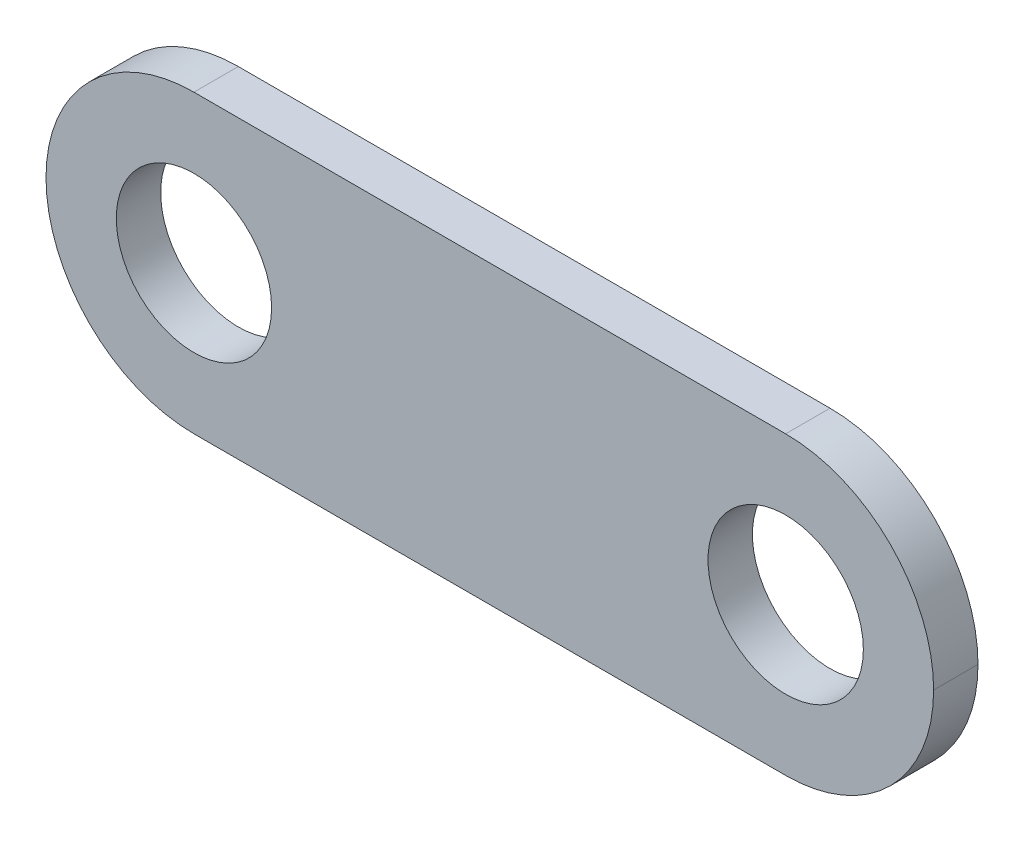
ISO-10303-21;
HEADER;
FILE_DESCRIPTION(('STEP AP214'),'2;1');
FILE_NAME('part.step','',(''),(''),'','','');
FILE_SCHEMA(('AUTOMOTIVE_DESIGN { 1 0 10303 214 1 1 1 1 }'));
ENDSEC;
DATA;
#1=APPLICATION_CONTEXT('core data for automotive mechanical design processes');
#2=APPLICATION_PROTOCOL_DEFINITION('international standard','automotive_design',2000,#1);
#3=PRODUCT_CONTEXT('',#1,'mechanical');
#4=PRODUCT('Part','Part','',(#3));
#5=PRODUCT_RELATED_PRODUCT_CATEGORY('part','',(#4));
#6=PRODUCT_DEFINITION_FORMATION('','',#4);
#7=PRODUCT_DEFINITION_CONTEXT('part definition',#1,'design');
#8=PRODUCT_DEFINITION('design','',#6,#7);
#9=PRODUCT_DEFINITION_SHAPE('','',#8);
#10=(LENGTH_UNIT() NAMED_UNIT(*) SI_UNIT(.MILLI.,.METRE.));
#11=(NAMED_UNIT(*) PLANE_ANGLE_UNIT() SI_UNIT($,.RADIAN.));
#12=(NAMED_UNIT(*) SI_UNIT($,.STERADIAN.) SOLID_ANGLE_UNIT());
#13=UNCERTAINTY_MEASURE_WITH_UNIT(LENGTH_MEASURE(1.E-05),#10,'distance_accuracy_value','');
#14=(GEOMETRIC_REPRESENTATION_CONTEXT(3) GLOBAL_UNCERTAINTY_ASSIGNED_CONTEXT((#13)) GLOBAL_UNIT_ASSIGNED_CONTEXT((#10,
#11,#12)) REPRESENTATION_CONTEXT('',''));
#15=CARTESIAN_POINT('',(0.,0.,0.));
#16=DIRECTION('',(0.,0.,1.));
#17=DIRECTION('',(1.,0.,0.));
#18=AXIS2_PLACEMENT_3D('',#15,#16,#17);
#19=CARTESIAN_POINT('',(0.,0.,0.));
#20=DIRECTION('',(0.,0.,-1.));
#21=DIRECTION('',(-1.,0.,0.));
#22=AXIS2_PLACEMENT_3D('',#19,#20,#21);
#23=PLANE('',#22);
#24=CARTESIAN_POINT('',(50.,10.,0.));
#25=DIRECTION('',(0.,0.,-1.));
#26=DIRECTION('',(-1.,0.,0.));
#27=AXIS2_PLACEMENT_3D('',#24,#25,#26);
#28=CIRCLE('',#27,10.);
#29=CARTESIAN_POINT('',(50.,20.,0.));
#30=VERTEX_POINT('',#29);
#31=CARTESIAN_POINT('',(60.,10.,0.));
#32=VERTEX_POINT('',#31);
#33=EDGE_CURVE('E99',#30,#32,#28,.T.);
#34=ORIENTED_EDGE('',*,*,#33,.T.);
#35=CARTESIAN_POINT('',(50.,10.,0.));
#36=DIRECTION('',(0.,0.,-1.));
#37=DIRECTION('',(-1.,0.,0.));
#38=AXIS2_PLACEMENT_3D('',#35,#36,#37);
#39=CIRCLE('',#38,10.);
#40=CARTESIAN_POINT('',(50.,0.,0.));
#41=VERTEX_POINT('',#40);
#42=EDGE_CURVE('E129',#32,#41,#39,.T.);
#43=ORIENTED_EDGE('',*,*,#42,.T.);
#44=DIRECTION('',(1.,0.,0.));
#45=VECTOR('',#44,1.);
#46=CARTESIAN_POINT('',(0.,0.,0.));
#47=LINE('',#46,#45);
#48=CARTESIAN_POINT('',(10.,0.,0.));
#49=VERTEX_POINT('',#48);
#50=EDGE_CURVE('E94',#49,#41,#47,.T.);
#51=ORIENTED_EDGE('',*,*,#50,.F.);
#52=CARTESIAN_POINT('',(10.,10.,0.));
#53=DIRECTION('',(0.,0.,-1.));
#54=DIRECTION('',(-1.,0.,0.));
#55=AXIS2_PLACEMENT_3D('',#52,#53,#54);
#56=CIRCLE('',#55,10.);
#57=CARTESIAN_POINT('',(0.,10.,0.));
#58=VERTEX_POINT('',#57);
#59=EDGE_CURVE('E88',#49,#58,#56,.T.);
#60=ORIENTED_EDGE('',*,*,#59,.T.);
#61=CARTESIAN_POINT('',(10.,10.,0.));
#62=DIRECTION('',(0.,0.,-1.));
#63=DIRECTION('',(-1.,0.,0.));
#64=AXIS2_PLACEMENT_3D('',#61,#62,#63);
#65=CIRCLE('',#64,10.);
#66=CARTESIAN_POINT('',(10.,20.,0.));
#67=VERTEX_POINT('',#66);
#68=EDGE_CURVE('E92',#58,#67,#65,.T.);
#69=ORIENTED_EDGE('',*,*,#68,.T.);
#70=DIRECTION('',(-1.,0.,0.));
#71=VECTOR('',#70,1.);
#72=CARTESIAN_POINT('',(0.,20.,0.));
#73=LINE('',#72,#71);
#74=EDGE_CURVE('E124',#30,#67,#73,.T.);
#75=ORIENTED_EDGE('',*,*,#74,.F.);
#76=EDGE_LOOP('',(#34,#43,#51,#60,#69,#75));
#77=FACE_BOUND('',#76,.T.);
#78=CARTESIAN_POINT('',(50.,10.,0.));
#79=DIRECTION('',(0.,0.,1.));
#80=DIRECTION('',(1.,0.,0.));
#81=AXIS2_PLACEMENT_3D('',#78,#79,#80);
#82=CIRCLE('',#81,5.25);
#83=CARTESIAN_POINT('',(55.25,10.,0.));
#84=VERTEX_POINT('',#83);
#85=EDGE_CURVE('E110',#84,#84,#82,.T.);
#86=ORIENTED_EDGE('',*,*,#85,.T.);
#87=EDGE_LOOP('',(#86));
#88=FACE_BOUND('',#87,.T.);
#89=CARTESIAN_POINT('',(9.99999999999999,10.,0.));
#90=DIRECTION('',(0.,0.,1.));
#91=DIRECTION('',(1.,0.,0.));
#92=AXIS2_PLACEMENT_3D('',#89,#90,#91);
#93=CIRCLE('',#92,5.25);
#94=CARTESIAN_POINT('',(15.25,10.,0.));
#95=VERTEX_POINT('',#94);
#96=EDGE_CURVE('E117',#95,#95,#93,.T.);
#97=ORIENTED_EDGE('',*,*,#96,.T.);
#98=EDGE_LOOP('',(#97));
#99=FACE_BOUND('',#98,.T.);
#100=ADVANCED_FACE('F35',(#77,#88,#99),#23,.T.);
#101=CARTESIAN_POINT('',(0.,0.,3.));
#102=DIRECTION('',(0.,1.,0.));
#103=DIRECTION('',(0.,0.,1.));
#104=AXIS2_PLACEMENT_3D('',#101,#102,#103);
#105=PLANE('',#104);
#106=ORIENTED_EDGE('',*,*,#50,.T.);
#107=DIRECTION('',(0.,0.,-1.));
#108=VECTOR('',#107,1.);
#109=CARTESIAN_POINT('',(50.,0.,3.));
#110=LINE('',#109,#108);
#111=CARTESIAN_POINT('',(50.,0.,3.));
#112=VERTEX_POINT('',#111);
#113=EDGE_CURVE('E133',#41,#112,#110,.F.);
#114=ORIENTED_EDGE('',*,*,#113,.T.);
#115=DIRECTION('',(1.,0.,0.));
#116=VECTOR('',#115,1.);
#117=CARTESIAN_POINT('',(0.,0.,3.));
#118=LINE('',#117,#116);
#119=CARTESIAN_POINT('',(10.,0.,3.));
#120=VERTEX_POINT('',#119);
#121=EDGE_CURVE('E121',#120,#112,#118,.T.);
#122=ORIENTED_EDGE('',*,*,#121,.F.);
#123=DIRECTION('',(0.,0.,-1.));
#124=VECTOR('',#123,1.);
#125=CARTESIAN_POINT('',(10.,0.,3.));
#126=LINE('',#125,#124);
#127=EDGE_CURVE('E131',#120,#49,#126,.T.);
#128=ORIENTED_EDGE('',*,*,#127,.T.);
#129=EDGE_LOOP('',(#106,#114,#122,#128));
#130=FACE_BOUND('',#129,.T.);
#131=ADVANCED_FACE('F154',(#130),#105,.F.);
#132=CARTESIAN_POINT('',(0.,20.,3.));
#133=DIRECTION('',(0.,-1.,0.));
#134=DIRECTION('',(0.,0.,-1.));
#135=AXIS2_PLACEMENT_3D('',#132,#133,#134);
#136=PLANE('',#135);
#137=DIRECTION('',(-1.,0.,0.));
#138=VECTOR('',#137,1.);
#139=CARTESIAN_POINT('',(0.,20.,3.));
#140=LINE('',#139,#138);
#141=CARTESIAN_POINT('',(50.,20.,3.));
#142=VERTEX_POINT('',#141);
#143=CARTESIAN_POINT('',(10.,20.,3.));
#144=VERTEX_POINT('',#143);
#145=EDGE_CURVE('E105',#142,#144,#140,.T.);
#146=ORIENTED_EDGE('',*,*,#145,.F.);
#147=DIRECTION('',(0.,0.,-1.));
#148=VECTOR('',#147,1.);
#149=CARTESIAN_POINT('',(50.,20.,3.));
#150=LINE('',#149,#148);
#151=EDGE_CURVE('E11',#142,#30,#150,.T.);
#152=ORIENTED_EDGE('',*,*,#151,.T.);
#153=ORIENTED_EDGE('',*,*,#74,.T.);
#154=DIRECTION('',(0.,0.,-1.));
#155=VECTOR('',#154,1.);
#156=CARTESIAN_POINT('',(10.,20.,3.));
#157=LINE('',#156,#155);
#158=EDGE_CURVE('E44',#67,#144,#157,.F.);
#159=ORIENTED_EDGE('',*,*,#158,.T.);
#160=EDGE_LOOP('',(#146,#152,#153,#159));
#161=FACE_BOUND('',#160,.T.);
#162=ADVANCED_FACE('F156',(#161),#136,.F.);
#163=CARTESIAN_POINT('',(0.,0.,3.));
#164=DIRECTION('',(0.,0.,-1.));
#165=DIRECTION('',(-1.,0.,0.));
#166=AXIS2_PLACEMENT_3D('',#163,#164,#165);
#167=PLANE('',#166);
#168=CARTESIAN_POINT('',(9.99999999999999,10.,3.));
#169=DIRECTION('',(0.,0.,1.));
#170=DIRECTION('',(1.,0.,0.));
#171=AXIS2_PLACEMENT_3D('',#168,#169,#170);
#172=CIRCLE('',#171,5.25);
#173=CARTESIAN_POINT('',(15.25,10.,3.));
#174=VERTEX_POINT('',#173);
#175=EDGE_CURVE('E247',#174,#174,#172,.T.);
#176=ORIENTED_EDGE('',*,*,#175,.F.);
#177=EDGE_LOOP('',(#176));
#178=FACE_BOUND('',#177,.T.);
#179=CARTESIAN_POINT('',(50.,10.,3.));
#180=DIRECTION('',(0.,0.,1.));
#181=DIRECTION('',(1.,0.,0.));
#182=AXIS2_PLACEMENT_3D('',#179,#180,#181);
#183=CIRCLE('',#182,5.25);
#184=CARTESIAN_POINT('',(55.25,10.,3.));
#185=VERTEX_POINT('',#184);
#186=EDGE_CURVE('E113',#185,#185,#183,.T.);
#187=ORIENTED_EDGE('',*,*,#186,.F.);
#188=EDGE_LOOP('',(#187));
#189=FACE_BOUND('',#188,.T.);
#190=ORIENTED_EDGE('',*,*,#121,.T.);
#191=CARTESIAN_POINT('',(50.,10.,3.));
#192=DIRECTION('',(0.,0.,-1.));
#193=DIRECTION('',(-1.,0.,0.));
#194=AXIS2_PLACEMENT_3D('',#191,#192,#193);
#195=CIRCLE('',#194,10.);
#196=CARTESIAN_POINT('',(60.,10.,3.));
#197=VERTEX_POINT('',#196);
#198=EDGE_CURVE('E140',#112,#197,#195,.F.);
#199=ORIENTED_EDGE('',*,*,#198,.T.);
#200=CARTESIAN_POINT('',(50.,10.,3.));
#201=DIRECTION('',(0.,0.,-1.));
#202=DIRECTION('',(-1.,0.,0.));
#203=AXIS2_PLACEMENT_3D('',#200,#201,#202);
#204=CIRCLE('',#203,10.);
#205=EDGE_CURVE('E58',#197,#142,#204,.F.);
#206=ORIENTED_EDGE('',*,*,#205,.T.);
#207=ORIENTED_EDGE('',*,*,#145,.T.);
#208=CARTESIAN_POINT('',(10.,10.,3.));
#209=DIRECTION('',(0.,0.,-1.));
#210=DIRECTION('',(-1.,0.,0.));
#211=AXIS2_PLACEMENT_3D('',#208,#209,#210);
#212=CIRCLE('',#211,10.);
#213=CARTESIAN_POINT('',(0.,10.,3.));
#214=VERTEX_POINT('',#213);
#215=EDGE_CURVE('E136',#144,#214,#212,.F.);
#216=ORIENTED_EDGE('',*,*,#215,.T.);
#217=CARTESIAN_POINT('',(10.,10.,3.));
#218=DIRECTION('',(0.,0.,-1.));
#219=DIRECTION('',(-1.,0.,0.));
#220=AXIS2_PLACEMENT_3D('',#217,#218,#219);
#221=CIRCLE('',#220,10.);
#222=EDGE_CURVE('E108',#214,#120,#221,.F.);
#223=ORIENTED_EDGE('',*,*,#222,.T.);
#224=EDGE_LOOP('',(#190,#199,#206,#207,#216,#223));
#225=FACE_BOUND('',#224,.T.);
#226=ADVANCED_FACE('F142',(#178,#189,#225),#167,.F.);
#227=CARTESIAN_POINT('',(50.,10.,3.));
#228=DIRECTION('',(0.,0.,-1.));
#229=DIRECTION('',(-1.,0.,0.));
#230=AXIS2_PLACEMENT_3D('',#227,#228,#229);
#231=CYLINDRICAL_SURFACE('',#230,10.);
#232=ORIENTED_EDGE('',*,*,#151,.F.);
#233=ORIENTED_EDGE('',*,*,#205,.F.);
#234=DIRECTION('',(0.,0.,-1.));
#235=VECTOR('',#234,1.);
#236=CARTESIAN_POINT('',(60.,10.,3.));
#237=LINE('',#236,#235);
#238=EDGE_CURVE('E109',#32,#197,#237,.F.);
#239=ORIENTED_EDGE('',*,*,#238,.F.);
#240=ORIENTED_EDGE('',*,*,#33,.F.);
#241=EDGE_LOOP('',(#232,#233,#239,#240));
#242=FACE_BOUND('',#241,.T.);
#243=ADVANCED_FACE('F149',(#242),#231,.T.);
#244=CARTESIAN_POINT('',(50.,10.,3.));
#245=DIRECTION('',(0.,0.,-1.));
#246=DIRECTION('',(-1.,0.,0.));
#247=AXIS2_PLACEMENT_3D('',#244,#245,#246);
#248=CYLINDRICAL_SURFACE('',#247,10.);
#249=ORIENTED_EDGE('',*,*,#198,.F.);
#250=ORIENTED_EDGE('',*,*,#113,.F.);
#251=ORIENTED_EDGE('',*,*,#42,.F.);
#252=ORIENTED_EDGE('',*,*,#238,.T.);
#253=EDGE_LOOP('',(#249,#250,#251,#252));
#254=FACE_BOUND('',#253,.T.);
#255=ADVANCED_FACE('F152',(#254),#248,.T.);
#256=CARTESIAN_POINT('',(10.,10.,3.));
#257=DIRECTION('',(0.,0.,-1.));
#258=DIRECTION('',(-1.,0.,0.));
#259=AXIS2_PLACEMENT_3D('',#256,#257,#258);
#260=CYLINDRICAL_SURFACE('',#259,10.);
#261=DIRECTION('',(0.,0.,-1.));
#262=VECTOR('',#261,1.);
#263=CARTESIAN_POINT('',(0.,10.,3.));
#264=LINE('',#263,#262);
#265=EDGE_CURVE('E39',#214,#58,#264,.T.);
#266=ORIENTED_EDGE('',*,*,#265,.F.);
#267=ORIENTED_EDGE('',*,*,#215,.F.);
#268=ORIENTED_EDGE('',*,*,#158,.F.);
#269=ORIENTED_EDGE('',*,*,#68,.F.);
#270=EDGE_LOOP('',(#266,#267,#268,#269));
#271=FACE_BOUND('',#270,.T.);
#272=ADVANCED_FACE('F37',(#271),#260,.T.);
#273=CARTESIAN_POINT('',(10.,10.,3.));
#274=DIRECTION('',(0.,0.,-1.));
#275=DIRECTION('',(-1.,0.,0.));
#276=AXIS2_PLACEMENT_3D('',#273,#274,#275);
#277=CYLINDRICAL_SURFACE('',#276,10.);
#278=ORIENTED_EDGE('',*,*,#222,.F.);
#279=ORIENTED_EDGE('',*,*,#265,.T.);
#280=ORIENTED_EDGE('',*,*,#59,.F.);
#281=ORIENTED_EDGE('',*,*,#127,.F.);
#282=EDGE_LOOP('',(#278,#279,#280,#281));
#283=FACE_BOUND('',#282,.T.);
#284=ADVANCED_FACE('F107',(#283),#277,.T.);
#285=CARTESIAN_POINT('',(50.,10.,3.));
#286=DIRECTION('',(0.,0.,1.));
#287=DIRECTION('',(1.,0.,0.));
#288=AXIS2_PLACEMENT_3D('',#285,#286,#287);
#289=CYLINDRICAL_SURFACE('',#288,5.25);
#290=ORIENTED_EDGE('',*,*,#85,.F.);
#291=EDGE_LOOP('',(#290));
#292=FACE_BOUND('',#291,.T.);
#293=ORIENTED_EDGE('',*,*,#186,.T.);
#294=EDGE_LOOP('',(#293));
#295=FACE_BOUND('',#294,.T.);
#296=ADVANCED_FACE('F169',(#292,#295),#289,.F.);
#297=CARTESIAN_POINT('',(9.99999999999999,10.,3.));
#298=DIRECTION('',(0.,0.,1.));
#299=DIRECTION('',(1.,0.,0.));
#300=AXIS2_PLACEMENT_3D('',#297,#298,#299);
#301=CYLINDRICAL_SURFACE('',#300,5.25);
#302=ORIENTED_EDGE('',*,*,#96,.F.);
#303=EDGE_LOOP('',(#302));
#304=FACE_BOUND('',#303,.T.);
#305=ORIENTED_EDGE('',*,*,#175,.T.);
#306=EDGE_LOOP('',(#305));
#307=FACE_BOUND('',#306,.T.);
#308=ADVANCED_FACE('F174',(#304,#307),#301,.F.);
#309=CLOSED_SHELL('',(#100,#131,#162,#226,#243,#255,#272,#284,#296,#308));
#310=MANIFOLD_SOLID_BREP('B2',#309);
#311=ADVANCED_BREP_SHAPE_REPRESENTATION('',(#18,#310),#14);
#312=SHAPE_DEFINITION_REPRESENTATION(#9,#311);
ENDSEC;
END-ISO-10303-21;
